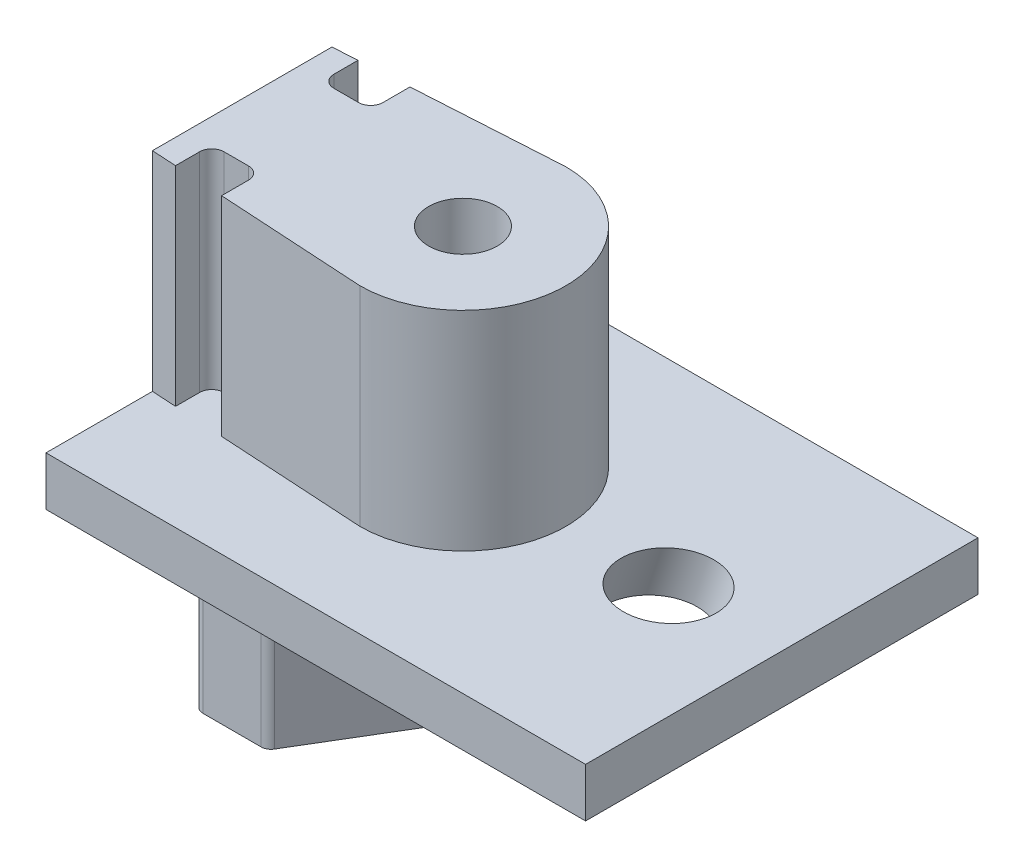
ISO-10303-21;
HEADER;
FILE_DESCRIPTION(('STEP AP214'),'2;1');
FILE_NAME('part.step','',(''),(''),'','','');
FILE_SCHEMA(('AUTOMOTIVE_DESIGN { 1 0 10303 214 1 1 1 1 }'));
ENDSEC;
DATA;
#1=APPLICATION_CONTEXT('core data for automotive mechanical design processes');
#2=APPLICATION_PROTOCOL_DEFINITION('international standard','automotive_design',2000,#1);
#3=PRODUCT_CONTEXT('',#1,'mechanical');
#4=PRODUCT('Part','Part','',(#3));
#5=PRODUCT_RELATED_PRODUCT_CATEGORY('part','',(#4));
#6=PRODUCT_DEFINITION_FORMATION('','',#4);
#7=PRODUCT_DEFINITION_CONTEXT('part definition',#1,'design');
#8=PRODUCT_DEFINITION('design','',#6,#7);
#9=PRODUCT_DEFINITION_SHAPE('','',#8);
#10=(LENGTH_UNIT() NAMED_UNIT(*) SI_UNIT(.MILLI.,.METRE.));
#11=(NAMED_UNIT(*) PLANE_ANGLE_UNIT() SI_UNIT($,.RADIAN.));
#12=(NAMED_UNIT(*) SI_UNIT($,.STERADIAN.) SOLID_ANGLE_UNIT());
#13=UNCERTAINTY_MEASURE_WITH_UNIT(LENGTH_MEASURE(1.E-05),#10,'distance_accuracy_value','');
#14=(GEOMETRIC_REPRESENTATION_CONTEXT(3) GLOBAL_UNCERTAINTY_ASSIGNED_CONTEXT((#13)) GLOBAL_UNIT_ASSIGNED_CONTEXT((#10,
#11,#12)) REPRESENTATION_CONTEXT('',''));
#15=CARTESIAN_POINT('',(0.,0.,0.));
#16=DIRECTION('',(0.,0.,1.));
#17=DIRECTION('',(1.,0.,0.));
#18=AXIS2_PLACEMENT_3D('',#15,#16,#17);
#19=CARTESIAN_POINT('',(-2.50000000000002,2.125,0.9));
#20=DIRECTION('',(0.0598922907279451,0.,-0.998204845465779));
#21=DIRECTION('',(-0.998204845465779,0.,-0.0598922907279451));
#22=AXIS2_PLACEMENT_3D('',#19,#20,#21);
#23=PLANE('',#22);
#24=DIRECTION('',(0.998204845465779,0.,0.0598922907279451));
#25=VECTOR('',#24,1.);
#26=CARTESIAN_POINT('',(-2.50000000000002,2.125,0.9));
#27=LINE('',#26,#25);
#28=CARTESIAN_POINT('',(-2.25,2.125,0.915000000000001));
#29=VERTEX_POINT('',#28);
#30=CARTESIAN_POINT('',(-2.,2.125,0.93));
#31=VERTEX_POINT('',#30);
#32=EDGE_CURVE('E298',#29,#31,#27,.T.);
#33=ORIENTED_EDGE('',*,*,#32,.F.);
#34=DIRECTION('',(0.,-1.,0.));
#35=VECTOR('',#34,1.);
#36=CARTESIAN_POINT('',(-2.25,2.125,0.915000000000001));
#37=LINE('',#36,#35);
#38=CARTESIAN_POINT('',(-2.25,0.,0.915000000000001));
#39=VERTEX_POINT('',#38);
#40=EDGE_CURVE('E246',#29,#39,#37,.T.);
#41=ORIENTED_EDGE('',*,*,#40,.T.);
#42=DIRECTION('',(0.998204845465779,0.,0.0598922907279451));
#43=VECTOR('',#42,1.);
#44=CARTESIAN_POINT('',(-2.50000000000002,0.,0.9));
#45=LINE('',#44,#43);
#46=CARTESIAN_POINT('',(-2.,0.,0.93));
#47=VERTEX_POINT('',#46);
#48=EDGE_CURVE('E273',#39,#47,#45,.T.);
#49=ORIENTED_EDGE('',*,*,#48,.T.);
#50=DIRECTION('',(0.,-1.,0.));
#51=VECTOR('',#50,1.);
#52=CARTESIAN_POINT('',(-2.,2.125,0.93));
#53=LINE('',#52,#51);
#54=EDGE_CURVE('E311',#31,#47,#53,.T.);
#55=ORIENTED_EDGE('',*,*,#54,.F.);
#56=EDGE_LOOP('',(#33,#41,#49,#55));
#57=FACE_BOUND('',#56,.T.);
#58=ADVANCED_FACE('F37',(#57),#23,.F.);
#59=CARTESIAN_POINT('',(-2.,2.125,0.93));
#60=DIRECTION('',(-1.,0.,0.));
#61=DIRECTION('',(0.,0.,1.));
#62=AXIS2_PLACEMENT_3D('',#59,#60,#61);
#63=PLANE('',#62);
#64=DIRECTION('',(0.,0.,-1.));
#65=VECTOR('',#64,1.);
#66=CARTESIAN_POINT('',(-2.,0.,0.93));
#67=LINE('',#66,#65);
#68=CARTESIAN_POINT('',(-2.,0.,0.685));
#69=VERTEX_POINT('',#68);
#70=EDGE_CURVE('E276',#47,#69,#67,.T.);
#71=ORIENTED_EDGE('',*,*,#70,.T.);
#72=DIRECTION('',(0.,-1.,0.));
#73=VECTOR('',#72,1.);
#74=CARTESIAN_POINT('',(-2.,2.125,0.685));
#75=LINE('',#74,#73);
#76=CARTESIAN_POINT('',(-2.,2.125,0.685));
#77=VERTEX_POINT('',#76);
#78=EDGE_CURVE('E319',#69,#77,#75,.F.);
#79=ORIENTED_EDGE('',*,*,#78,.T.);
#80=DIRECTION('',(0.,0.,-1.));
#81=VECTOR('',#80,1.);
#82=CARTESIAN_POINT('',(-2.,2.125,0.93));
#83=LINE('',#82,#81);
#84=EDGE_CURVE('E487',#31,#77,#83,.T.);
#85=ORIENTED_EDGE('',*,*,#84,.F.);
#86=ORIENTED_EDGE('',*,*,#54,.T.);
#87=EDGE_LOOP('',(#71,#79,#85,#86));
#88=FACE_BOUND('',#87,.T.);
#89=ADVANCED_FACE('F559',(#88),#63,.F.);
#90=CARTESIAN_POINT('',(-1.5,2.125,0.56));
#91=DIRECTION('',(0.,0.,1.));
#92=DIRECTION('',(1.,0.,0.));
#93=AXIS2_PLACEMENT_3D('',#90,#91,#92);
#94=PLANE('',#93);
#95=DIRECTION('',(-1.,0.,0.));
#96=VECTOR('',#95,1.);
#97=CARTESIAN_POINT('',(-1.5,2.125,0.56));
#98=LINE('',#97,#96);
#99=CARTESIAN_POINT('',(-1.625,2.125,0.56));
#100=VERTEX_POINT('',#99);
#101=CARTESIAN_POINT('',(-1.875,2.125,0.56));
#102=VERTEX_POINT('',#101);
#103=EDGE_CURVE('E490',#100,#102,#98,.T.);
#104=ORIENTED_EDGE('',*,*,#103,.T.);
#105=DIRECTION('',(0.,-1.,0.));
#106=VECTOR('',#105,1.);
#107=CARTESIAN_POINT('',(-1.875,2.125,0.56));
#108=LINE('',#107,#106);
#109=CARTESIAN_POINT('',(-1.875,0.,0.56));
#110=VERTEX_POINT('',#109);
#111=EDGE_CURVE('E316',#102,#110,#108,.T.);
#112=ORIENTED_EDGE('',*,*,#111,.T.);
#113=DIRECTION('',(-1.,0.,0.));
#114=VECTOR('',#113,1.);
#115=CARTESIAN_POINT('',(-1.5,0.,0.56));
#116=LINE('',#115,#114);
#117=CARTESIAN_POINT('',(-1.625,0.,0.56));
#118=VERTEX_POINT('',#117);
#119=EDGE_CURVE('E280',#118,#110,#116,.T.);
#120=ORIENTED_EDGE('',*,*,#119,.F.);
#121=DIRECTION('',(0.,-1.,0.));
#122=VECTOR('',#121,1.);
#123=CARTESIAN_POINT('',(-1.625,2.125,0.56));
#124=LINE('',#123,#122);
#125=EDGE_CURVE('E314',#118,#100,#124,.F.);
#126=ORIENTED_EDGE('',*,*,#125,.T.);
#127=EDGE_LOOP('',(#104,#112,#120,#126));
#128=FACE_BOUND('',#127,.T.);
#129=ADVANCED_FACE('F549',(#128),#94,.T.);
#130=CARTESIAN_POINT('',(-1.5,2.125,0.56));
#131=DIRECTION('',(1.,0.,0.));
#132=DIRECTION('',(0.,0.,-1.));
#133=AXIS2_PLACEMENT_3D('',#130,#131,#132);
#134=PLANE('',#133);
#135=DIRECTION('',(0.,0.,1.));
#136=VECTOR('',#135,1.);
#137=CARTESIAN_POINT('',(-1.5,2.125,0.56));
#138=LINE('',#137,#136);
#139=CARTESIAN_POINT('',(-1.5,2.125,0.685));
#140=VERTEX_POINT('',#139);
#141=CARTESIAN_POINT('',(-1.5,2.125,0.96));
#142=VERTEX_POINT('',#141);
#143=EDGE_CURVE('E493',#140,#142,#138,.T.);
#144=ORIENTED_EDGE('',*,*,#143,.F.);
#145=DIRECTION('',(0.,-1.,0.));
#146=VECTOR('',#145,1.);
#147=CARTESIAN_POINT('',(-1.5,2.125,0.685));
#148=LINE('',#147,#146);
#149=CARTESIAN_POINT('',(-1.5,0.,0.685));
#150=VERTEX_POINT('',#149);
#151=EDGE_CURVE('E321',#140,#150,#148,.T.);
#152=ORIENTED_EDGE('',*,*,#151,.T.);
#153=DIRECTION('',(0.,0.,1.));
#154=VECTOR('',#153,1.);
#155=CARTESIAN_POINT('',(-1.5,0.,0.56));
#156=LINE('',#155,#154);
#157=CARTESIAN_POINT('',(-1.5,0.,0.96));
#158=VERTEX_POINT('',#157);
#159=EDGE_CURVE('E282',#150,#158,#156,.T.);
#160=ORIENTED_EDGE('',*,*,#159,.T.);
#161=DIRECTION('',(0.,-1.,0.));
#162=VECTOR('',#161,1.);
#163=CARTESIAN_POINT('',(-1.5,2.125,0.96));
#164=LINE('',#163,#162);
#165=EDGE_CURVE('E308',#142,#158,#164,.T.);
#166=ORIENTED_EDGE('',*,*,#165,.F.);
#167=EDGE_LOOP('',(#144,#152,#160,#166));
#168=FACE_BOUND('',#167,.T.);
#169=ADVANCED_FACE('F539',(#168),#134,.F.);
#170=CARTESIAN_POINT('',(0.,2.125,1.05));
#171=DIRECTION('',(-0.0598922907279466,0.,0.998204845465779));
#172=DIRECTION('',(0.998204845465779,0.,0.0598922907279466));
#173=AXIS2_PLACEMENT_3D('',#170,#171,#172);
#174=PLANE('',#173);
#175=DIRECTION('',(-0.998204845465779,0.,-0.0598922907279466));
#176=VECTOR('',#175,1.);
#177=CARTESIAN_POINT('',(0.,0.,1.05));
#178=LINE('',#177,#176);
#179=CARTESIAN_POINT('',(0.,0.,1.05));
#180=VERTEX_POINT('',#179);
#181=EDGE_CURVE('E285',#180,#158,#178,.T.);
#182=ORIENTED_EDGE('',*,*,#181,.F.);
#183=DIRECTION('',(0.,-1.,0.));
#184=VECTOR('',#183,1.);
#185=CARTESIAN_POINT('',(0.,2.125,1.05));
#186=LINE('',#185,#184);
#187=CARTESIAN_POINT('',(0.,2.125,1.05));
#188=VERTEX_POINT('',#187);
#189=EDGE_CURVE('E305',#188,#180,#186,.T.);
#190=ORIENTED_EDGE('',*,*,#189,.F.);
#191=DIRECTION('',(-0.998204845465779,0.,-0.0598922907279466));
#192=VECTOR('',#191,1.);
#193=CARTESIAN_POINT('',(0.,2.125,1.05));
#194=LINE('',#193,#192);
#195=EDGE_CURVE('E495',#188,#142,#194,.T.);
#196=ORIENTED_EDGE('',*,*,#195,.T.);
#197=ORIENTED_EDGE('',*,*,#165,.T.);
#198=EDGE_LOOP('',(#182,#190,#196,#197));
#199=FACE_BOUND('',#198,.T.);
#200=ADVANCED_FACE('F535',(#199),#174,.T.);
#201=CARTESIAN_POINT('',(0.,2.125,0.));
#202=DIRECTION('',(0.,-1.,0.));
#203=DIRECTION('',(0.,0.,-1.));
#204=AXIS2_PLACEMENT_3D('',#201,#202,#203);
#205=CYLINDRICAL_SURFACE('',#204,1.05);
#206=CARTESIAN_POINT('',(0.,0.,0.));
#207=DIRECTION('',(0.,-1.,0.));
#208=DIRECTION('',(0.,0.,-1.));
#209=AXIS2_PLACEMENT_3D('',#206,#207,#208);
#210=CIRCLE('',#209,1.05);
#211=CARTESIAN_POINT('',(0.,0.,-1.05));
#212=VERTEX_POINT('',#211);
#213=EDGE_CURVE('E287',#212,#180,#210,.T.);
#214=ORIENTED_EDGE('',*,*,#213,.F.);
#215=DIRECTION('',(0.,-1.,0.));
#216=VECTOR('',#215,1.);
#217=CARTESIAN_POINT('',(0.,2.125,-1.05));
#218=LINE('',#217,#216);
#219=CARTESIAN_POINT('',(0.,2.125,-1.05));
#220=VERTEX_POINT('',#219);
#221=EDGE_CURVE('E302',#220,#212,#218,.T.);
#222=ORIENTED_EDGE('',*,*,#221,.F.);
#223=CARTESIAN_POINT('',(0.,2.125,0.));
#224=DIRECTION('',(0.,-1.,0.));
#225=DIRECTION('',(0.,0.,-1.));
#226=AXIS2_PLACEMENT_3D('',#223,#224,#225);
#227=CIRCLE('',#226,1.05);
#228=EDGE_CURVE('E498',#220,#188,#227,.T.);
#229=ORIENTED_EDGE('',*,*,#228,.T.);
#230=ORIENTED_EDGE('',*,*,#189,.T.);
#231=EDGE_LOOP('',(#214,#222,#229,#230));
#232=FACE_BOUND('',#231,.T.);
#233=ADVANCED_FACE('F531',(#232),#205,.T.);
#234=CARTESIAN_POINT('',(-1.5,2.125,-0.96));
#235=DIRECTION('',(-0.0598922907279466,0.,-0.998204845465779));
#236=DIRECTION('',(-0.998204845465779,0.,0.0598922907279466));
#237=AXIS2_PLACEMENT_3D('',#234,#235,#236);
#238=PLANE('',#237);
#239=DIRECTION('',(0.998204845465779,0.,-0.0598922907279466));
#240=VECTOR('',#239,1.);
#241=CARTESIAN_POINT('',(-1.5,0.,-0.96));
#242=LINE('',#241,#240);
#243=CARTESIAN_POINT('',(-1.5,0.,-0.96));
#244=VERTEX_POINT('',#243);
#245=EDGE_CURVE('E289',#244,#212,#242,.T.);
#246=ORIENTED_EDGE('',*,*,#245,.F.);
#247=DIRECTION('',(0.,-1.,0.));
#248=VECTOR('',#247,1.);
#249=CARTESIAN_POINT('',(-1.5,2.125,-0.96));
#250=LINE('',#249,#248);
#251=CARTESIAN_POINT('',(-1.5,2.125,-0.96));
#252=VERTEX_POINT('',#251);
#253=EDGE_CURVE('E267',#252,#244,#250,.T.);
#254=ORIENTED_EDGE('',*,*,#253,.F.);
#255=DIRECTION('',(0.998204845465779,0.,-0.0598922907279466));
#256=VECTOR('',#255,1.);
#257=CARTESIAN_POINT('',(-1.5,2.125,-0.96));
#258=LINE('',#257,#256);
#259=EDGE_CURVE('E501',#252,#220,#258,.T.);
#260=ORIENTED_EDGE('',*,*,#259,.T.);
#261=ORIENTED_EDGE('',*,*,#221,.T.);
#262=EDGE_LOOP('',(#246,#254,#260,#261));
#263=FACE_BOUND('',#262,.T.);
#264=ADVANCED_FACE('F527',(#263),#238,.T.);
#265=CARTESIAN_POINT('',(-1.5,2.125,-0.96));
#266=DIRECTION('',(1.,0.,0.));
#267=DIRECTION('',(0.,0.,-1.));
#268=AXIS2_PLACEMENT_3D('',#265,#266,#267);
#269=PLANE('',#268);
#270=DIRECTION('',(0.,0.,1.));
#271=VECTOR('',#270,1.);
#272=CARTESIAN_POINT('',(-1.5,0.,-0.96));
#273=LINE('',#272,#271);
#274=CARTESIAN_POINT('',(-1.5,0.,-0.685));
#275=VERTEX_POINT('',#274);
#276=EDGE_CURVE('E291',#244,#275,#273,.T.);
#277=ORIENTED_EDGE('',*,*,#276,.T.);
#278=DIRECTION('',(0.,-1.,0.));
#279=VECTOR('',#278,1.);
#280=CARTESIAN_POINT('',(-1.5,2.125,-0.685));
#281=LINE('',#280,#279);
#282=CARTESIAN_POINT('',(-1.5,2.125,-0.685));
#283=VERTEX_POINT('',#282);
#284=EDGE_CURVE('E329',#275,#283,#281,.F.);
#285=ORIENTED_EDGE('',*,*,#284,.T.);
#286=DIRECTION('',(0.,0.,1.));
#287=VECTOR('',#286,1.);
#288=CARTESIAN_POINT('',(-1.5,2.125,-0.96));
#289=LINE('',#288,#287);
#290=EDGE_CURVE('E504',#252,#283,#289,.T.);
#291=ORIENTED_EDGE('',*,*,#290,.F.);
#292=ORIENTED_EDGE('',*,*,#253,.T.);
#293=EDGE_LOOP('',(#277,#285,#291,#292));
#294=FACE_BOUND('',#293,.T.);
#295=ADVANCED_FACE('F522',(#294),#269,.F.);
#296=CARTESIAN_POINT('',(-2.,2.125,-0.56));
#297=DIRECTION('',(0.,0.,-1.));
#298=DIRECTION('',(-1.,0.,0.));
#299=AXIS2_PLACEMENT_3D('',#296,#297,#298);
#300=PLANE('',#299);
#301=DIRECTION('',(1.,0.,0.));
#302=VECTOR('',#301,1.);
#303=CARTESIAN_POINT('',(-2.,2.125,-0.56));
#304=LINE('',#303,#302);
#305=CARTESIAN_POINT('',(-1.875,2.125,-0.56));
#306=VERTEX_POINT('',#305);
#307=CARTESIAN_POINT('',(-1.625,2.125,-0.56));
#308=VERTEX_POINT('',#307);
#309=EDGE_CURVE('E269',#306,#308,#304,.T.);
#310=ORIENTED_EDGE('',*,*,#309,.T.);
#311=DIRECTION('',(0.,-1.,0.));
#312=VECTOR('',#311,1.);
#313=CARTESIAN_POINT('',(-1.625,2.125,-0.56));
#314=LINE('',#313,#312);
#315=CARTESIAN_POINT('',(-1.625,0.,-0.56));
#316=VERTEX_POINT('',#315);
#317=EDGE_CURVE('E326',#308,#316,#314,.T.);
#318=ORIENTED_EDGE('',*,*,#317,.T.);
#319=DIRECTION('',(1.,0.,0.));
#320=VECTOR('',#319,1.);
#321=CARTESIAN_POINT('',(-2.,0.,-0.56));
#322=LINE('',#321,#320);
#323=CARTESIAN_POINT('',(-1.875,0.,-0.56));
#324=VERTEX_POINT('',#323);
#325=EDGE_CURVE('E294',#324,#316,#322,.T.);
#326=ORIENTED_EDGE('',*,*,#325,.F.);
#327=DIRECTION('',(0.,-1.,0.));
#328=VECTOR('',#327,1.);
#329=CARTESIAN_POINT('',(-1.875,2.125,-0.56));
#330=LINE('',#329,#328);
#331=EDGE_CURVE('E324',#324,#306,#330,.F.);
#332=ORIENTED_EDGE('',*,*,#331,.T.);
#333=EDGE_LOOP('',(#310,#318,#326,#332));
#334=FACE_BOUND('',#333,.T.);
#335=ADVANCED_FACE('F510',(#334),#300,.T.);
#336=CARTESIAN_POINT('',(-2.,2.125,-0.93));
#337=DIRECTION('',(1.,0.,0.));
#338=DIRECTION('',(0.,0.,-1.));
#339=AXIS2_PLACEMENT_3D('',#336,#337,#338);
#340=PLANE('',#339);
#341=DIRECTION('',(0.,0.,1.));
#342=VECTOR('',#341,1.);
#343=CARTESIAN_POINT('',(-2.,2.125,-0.93));
#344=LINE('',#343,#342);
#345=CARTESIAN_POINT('',(-2.,2.125,-0.93));
#346=VERTEX_POINT('',#345);
#347=CARTESIAN_POINT('',(-2.,2.125,-0.685));
#348=VERTEX_POINT('',#347);
#349=EDGE_CURVE('E264',#346,#348,#344,.T.);
#350=ORIENTED_EDGE('',*,*,#349,.T.);
#351=DIRECTION('',(0.,-1.,0.));
#352=VECTOR('',#351,1.);
#353=CARTESIAN_POINT('',(-2.,0.,-0.685));
#354=LINE('',#353,#352);
#355=CARTESIAN_POINT('',(-2.,0.,-0.685));
#356=VERTEX_POINT('',#355);
#357=EDGE_CURVE('E331',#348,#356,#354,.T.);
#358=ORIENTED_EDGE('',*,*,#357,.T.);
#359=DIRECTION('',(0.,0.,1.));
#360=VECTOR('',#359,1.);
#361=CARTESIAN_POINT('',(-2.,0.,-0.93));
#362=LINE('',#361,#360);
#363=CARTESIAN_POINT('',(-2.,0.,-0.93));
#364=VERTEX_POINT('',#363);
#365=EDGE_CURVE('E296',#364,#356,#362,.T.);
#366=ORIENTED_EDGE('',*,*,#365,.F.);
#367=DIRECTION('',(0.,-1.,0.));
#368=VECTOR('',#367,1.);
#369=CARTESIAN_POINT('',(-2.,2.125,-0.93));
#370=LINE('',#369,#368);
#371=EDGE_CURVE('E265',#346,#364,#370,.T.);
#372=ORIENTED_EDGE('',*,*,#371,.F.);
#373=EDGE_LOOP('',(#350,#358,#366,#372));
#374=FACE_BOUND('',#373,.T.);
#375=ADVANCED_FACE('F673',(#374),#340,.T.);
#376=CARTESIAN_POINT('',(-2.50000000000002,2.125,-0.9));
#377=DIRECTION('',(-0.0598922907279451,0.,-0.998204845465779));
#378=DIRECTION('',(-0.998204845465779,0.,0.0598922907279451));
#379=AXIS2_PLACEMENT_3D('',#376,#377,#378);
#380=PLANE('',#379);
#381=DIRECTION('',(0.,-1.,0.));
#382=VECTOR('',#381,1.);
#383=CARTESIAN_POINT('',(-2.25,2.125,-0.915000000000001));
#384=LINE('',#383,#382);
#385=CARTESIAN_POINT('',(-2.25,2.125,-0.915));
#386=VERTEX_POINT('',#385);
#387=CARTESIAN_POINT('',(-2.25,0.,-0.915));
#388=VERTEX_POINT('',#387);
#389=EDGE_CURVE('E243',#386,#388,#384,.T.);
#390=ORIENTED_EDGE('',*,*,#389,.F.);
#391=DIRECTION('',(0.998204845465779,0.,-0.0598922907279451));
#392=VECTOR('',#391,1.);
#393=CARTESIAN_POINT('',(-2.50000000000002,2.125,-0.9));
#394=LINE('',#393,#392);
#395=EDGE_CURVE('E256',#386,#346,#394,.T.);
#396=ORIENTED_EDGE('',*,*,#395,.T.);
#397=ORIENTED_EDGE('',*,*,#371,.T.);
#398=DIRECTION('',(0.998204845465779,0.,-0.0598922907279451));
#399=VECTOR('',#398,1.);
#400=CARTESIAN_POINT('',(-2.50000000000002,0.,-0.9));
#401=LINE('',#400,#399);
#402=EDGE_CURVE('E258',#388,#364,#401,.T.);
#403=ORIENTED_EDGE('',*,*,#402,.F.);
#404=EDGE_LOOP('',(#390,#396,#397,#403));
#405=FACE_BOUND('',#404,.T.);
#406=ADVANCED_FACE('F254',(#405),#380,.T.);
#407=CARTESIAN_POINT('',(0.,2.125,0.));
#408=DIRECTION('',(0.,-1.,0.));
#409=DIRECTION('',(0.,0.,-1.));
#410=AXIS2_PLACEMENT_3D('',#407,#408,#409);
#411=PLANE('',#410);
#412=CARTESIAN_POINT('',(0.,2.125,0.));
#413=DIRECTION('',(0.,1.,0.));
#414=DIRECTION('',(0.,0.,1.));
#415=AXIS2_PLACEMENT_3D('',#412,#413,#414);
#416=CIRCLE('',#415,0.35);
#417=CARTESIAN_POINT('',(0.,2.125,0.35));
#418=VERTEX_POINT('',#417);
#419=EDGE_CURVE('E475',#418,#418,#416,.T.);
#420=ORIENTED_EDGE('',*,*,#419,.F.);
#421=EDGE_LOOP('',(#420));
#422=FACE_BOUND('',#421,.T.);
#423=ORIENTED_EDGE('',*,*,#395,.F.);
#424=DIRECTION('',(0.,0.,1.));
#425=VECTOR('',#424,1.);
#426=CARTESIAN_POINT('',(-2.25,2.125,2.));
#427=LINE('',#426,#425);
#428=EDGE_CURVE('E239',#386,#29,#427,.T.);
#429=ORIENTED_EDGE('',*,*,#428,.T.);
#430=ORIENTED_EDGE('',*,*,#32,.T.);
#431=ORIENTED_EDGE('',*,*,#84,.T.);
#432=CARTESIAN_POINT('',(-1.875,2.125,0.685));
#433=DIRECTION('',(0.,-1.,0.));
#434=DIRECTION('',(0.,0.,-1.));
#435=AXIS2_PLACEMENT_3D('',#432,#433,#434);
#436=CIRCLE('',#435,0.125);
#437=EDGE_CURVE('E336',#77,#102,#436,.T.);
#438=ORIENTED_EDGE('',*,*,#437,.T.);
#439=ORIENTED_EDGE('',*,*,#103,.F.);
#440=CARTESIAN_POINT('',(-1.625,2.125,0.685));
#441=DIRECTION('',(0.,-1.,0.));
#442=DIRECTION('',(0.,0.,-1.));
#443=AXIS2_PLACEMENT_3D('',#440,#441,#442);
#444=CIRCLE('',#443,0.125);
#445=EDGE_CURVE('E340',#100,#140,#444,.T.);
#446=ORIENTED_EDGE('',*,*,#445,.T.);
#447=ORIENTED_EDGE('',*,*,#143,.T.);
#448=ORIENTED_EDGE('',*,*,#195,.F.);
#449=ORIENTED_EDGE('',*,*,#228,.F.);
#450=ORIENTED_EDGE('',*,*,#259,.F.);
#451=ORIENTED_EDGE('',*,*,#290,.T.);
#452=CARTESIAN_POINT('',(-1.625,2.125,-0.685));
#453=DIRECTION('',(0.,-1.,0.));
#454=DIRECTION('',(0.,0.,-1.));
#455=AXIS2_PLACEMENT_3D('',#452,#453,#454);
#456=CIRCLE('',#455,0.125);
#457=EDGE_CURVE('E344',#283,#308,#456,.T.);
#458=ORIENTED_EDGE('',*,*,#457,.T.);
#459=ORIENTED_EDGE('',*,*,#309,.F.);
#460=CARTESIAN_POINT('',(-1.875,2.125,-0.685));
#461=DIRECTION('',(0.,-1.,0.));
#462=DIRECTION('',(0.,0.,-1.));
#463=AXIS2_PLACEMENT_3D('',#460,#461,#462);
#464=CIRCLE('',#463,0.125);
#465=EDGE_CURVE('E348',#306,#348,#464,.T.);
#466=ORIENTED_EDGE('',*,*,#465,.T.);
#467=ORIENTED_EDGE('',*,*,#349,.F.);
#468=EDGE_LOOP('',(#423,#429,#430,#431,#438,#439,#446,#447,#448,#449,#450,#451,#458,#459,#466,#467));
#469=FACE_BOUND('',#468,.T.);
#470=ADVANCED_FACE('F262',(#422,#469),#411,.F.);
#471=CARTESIAN_POINT('',(0.,0.,0.));
#472=DIRECTION('',(0.,1.,0.));
#473=DIRECTION('',(0.,0.,1.));
#474=AXIS2_PLACEMENT_3D('',#471,#472,#473);
#475=CYLINDRICAL_SURFACE('',#474,0.35);
#476=CARTESIAN_POINT('',(0.,0.,0.));
#477=DIRECTION('',(0.,1.,0.));
#478=DIRECTION('',(0.,0.,1.));
#479=AXIS2_PLACEMENT_3D('',#476,#477,#478);
#480=CIRCLE('',#479,0.35);
#481=CARTESIAN_POINT('',(0.,0.,0.35));
#482=VERTEX_POINT('',#481);
#483=EDGE_CURVE('E277',#482,#482,#480,.T.);
#484=ORIENTED_EDGE('',*,*,#483,.F.);
#485=EDGE_LOOP('',(#484));
#486=FACE_BOUND('',#485,.T.);
#487=ORIENTED_EDGE('',*,*,#419,.T.);
#488=EDGE_LOOP('',(#487));
#489=FACE_BOUND('',#488,.T.);
#490=ADVANCED_FACE('F598',(#486,#489),#475,.F.);
#491=CARTESIAN_POINT('',(-1.875,2.125,0.685));
#492=DIRECTION('',(0.,-1.,0.));
#493=DIRECTION('',(0.,0.,-1.));
#494=AXIS2_PLACEMENT_3D('',#491,#492,#493);
#495=CYLINDRICAL_SURFACE('',#494,0.125);
#496=ORIENTED_EDGE('',*,*,#437,.F.);
#497=ORIENTED_EDGE('',*,*,#78,.F.);
#498=CARTESIAN_POINT('',(-1.875,0.,0.685));
#499=DIRECTION('',(0.,-1.,0.));
#500=DIRECTION('',(0.,0.,-1.));
#501=AXIS2_PLACEMENT_3D('',#498,#499,#500);
#502=CIRCLE('',#501,0.125);
#503=EDGE_CURVE('E334',#110,#69,#502,.F.);
#504=ORIENTED_EDGE('',*,*,#503,.F.);
#505=ORIENTED_EDGE('',*,*,#111,.F.);
#506=EDGE_LOOP('',(#496,#497,#504,#505));
#507=FACE_BOUND('',#506,.T.);
#508=ADVANCED_FACE('F555',(#507),#495,.F.);
#509=CARTESIAN_POINT('',(-1.625,2.125,0.685));
#510=DIRECTION('',(0.,-1.,0.));
#511=DIRECTION('',(0.,0.,-1.));
#512=AXIS2_PLACEMENT_3D('',#509,#510,#511);
#513=CYLINDRICAL_SURFACE('',#512,0.125);
#514=ORIENTED_EDGE('',*,*,#445,.F.);
#515=ORIENTED_EDGE('',*,*,#125,.F.);
#516=CARTESIAN_POINT('',(-1.625,0.,0.685));
#517=DIRECTION('',(0.,-1.,0.));
#518=DIRECTION('',(0.,0.,-1.));
#519=AXIS2_PLACEMENT_3D('',#516,#517,#518);
#520=CIRCLE('',#519,0.125);
#521=EDGE_CURVE('E338',#150,#118,#520,.F.);
#522=ORIENTED_EDGE('',*,*,#521,.F.);
#523=ORIENTED_EDGE('',*,*,#151,.F.);
#524=EDGE_LOOP('',(#514,#515,#522,#523));
#525=FACE_BOUND('',#524,.T.);
#526=ADVANCED_FACE('F546',(#525),#513,.F.);
#527=CARTESIAN_POINT('',(-1.625,2.125,-0.685));
#528=DIRECTION('',(0.,-1.,0.));
#529=DIRECTION('',(0.,0.,-1.));
#530=AXIS2_PLACEMENT_3D('',#527,#528,#529);
#531=CYLINDRICAL_SURFACE('',#530,0.125);
#532=ORIENTED_EDGE('',*,*,#457,.F.);
#533=ORIENTED_EDGE('',*,*,#284,.F.);
#534=CARTESIAN_POINT('',(-1.625,0.,-0.685));
#535=DIRECTION('',(0.,-1.,0.));
#536=DIRECTION('',(0.,0.,-1.));
#537=AXIS2_PLACEMENT_3D('',#534,#535,#536);
#538=CIRCLE('',#537,0.125);
#539=EDGE_CURVE('E342',#316,#275,#538,.F.);
#540=ORIENTED_EDGE('',*,*,#539,.F.);
#541=ORIENTED_EDGE('',*,*,#317,.F.);
#542=EDGE_LOOP('',(#532,#533,#540,#541));
#543=FACE_BOUND('',#542,.T.);
#544=ADVANCED_FACE('F517',(#543),#531,.F.);
#545=CARTESIAN_POINT('',(-1.875,2.125,-0.685));
#546=DIRECTION('',(0.,1.,0.));
#547=DIRECTION('',(0.,0.,1.));
#548=AXIS2_PLACEMENT_3D('',#545,#546,#547);
#549=CYLINDRICAL_SURFACE('',#548,0.125);
#550=ORIENTED_EDGE('',*,*,#465,.F.);
#551=ORIENTED_EDGE('',*,*,#331,.F.);
#552=CARTESIAN_POINT('',(-1.875,0.,-0.685));
#553=DIRECTION('',(0.,-1.,0.));
#554=DIRECTION('',(0.,0.,-1.));
#555=AXIS2_PLACEMENT_3D('',#552,#553,#554);
#556=CIRCLE('',#555,0.125);
#557=EDGE_CURVE('E346',#356,#324,#556,.F.);
#558=ORIENTED_EDGE('',*,*,#557,.F.);
#559=ORIENTED_EDGE('',*,*,#357,.F.);
#560=EDGE_LOOP('',(#550,#551,#558,#559));
#561=FACE_BOUND('',#560,.T.);
#562=ADVANCED_FACE('F603',(#561),#549,.F.);
#563=CARTESIAN_POINT('',(0.,0.,0.));
#564=DIRECTION('',(0.,-1.,0.));
#565=DIRECTION('',(0.,0.,-1.));
#566=AXIS2_PLACEMENT_3D('',#563,#564,#565);
#567=PLANE('',#566);
#568=CARTESIAN_POINT('',(0.,0.,0.));
#569=DIRECTION('',(0.,1.,0.));
#570=DIRECTION('',(0.,0.,1.));
#571=AXIS2_PLACEMENT_3D('',#568,#569,#570);
#572=CIRCLE('',#571,0.125);
#573=CARTESIAN_POINT('',(0.,0.,0.125));
#574=VERTEX_POINT('',#573);
#575=EDGE_CURVE('E442',#574,#574,#572,.T.);
#576=ORIENTED_EDGE('',*,*,#575,.F.);
#577=EDGE_LOOP('',(#576));
#578=FACE_BOUND('',#577,.T.);
#579=ORIENTED_EDGE('',*,*,#483,.T.);
#580=EDGE_LOOP('',(#579));
#581=FACE_BOUND('',#580,.T.);
#582=ADVANCED_FACE('F606',(#578,#581),#567,.F.);
#583=CARTESIAN_POINT('',(2.09546854596071,0.,0.));
#584=DIRECTION('',(0.,-1.,0.));
#585=DIRECTION('',(1.,0.,0.));
#586=AXIS2_PLACEMENT_3D('',#583,#584,#585);
#587=ELLIPSE('',#586,0.484882574559151,0.46);
#588=CARTESIAN_POINT('',(2.58035112051986,0.,0.));
#589=VERTEX_POINT('',#588);
#590=EDGE_CURVE('E353',#589,#589,#587,.T.);
#591=ORIENTED_EDGE('',*,*,#590,.T.);
#592=EDGE_LOOP('',(#591));
#593=FACE_BOUND('',#592,.T.);
#594=DIRECTION('',(0.,0.,1.));
#595=VECTOR('',#594,1.);
#596=CARTESIAN_POINT('',(-2.25,0.,2.));
#597=LINE('',#596,#595);
#598=CARTESIAN_POINT('',(-2.25,0.,-2.));
#599=VERTEX_POINT('',#598);
#600=EDGE_CURVE('E465',#599,#388,#597,.T.);
#601=ORIENTED_EDGE('',*,*,#600,.T.);
#602=ORIENTED_EDGE('',*,*,#402,.T.);
#603=ORIENTED_EDGE('',*,*,#365,.T.);
#604=ORIENTED_EDGE('',*,*,#557,.T.);
#605=ORIENTED_EDGE('',*,*,#325,.T.);
#606=ORIENTED_EDGE('',*,*,#539,.T.);
#607=ORIENTED_EDGE('',*,*,#276,.F.);
#608=ORIENTED_EDGE('',*,*,#245,.T.);
#609=ORIENTED_EDGE('',*,*,#213,.T.);
#610=ORIENTED_EDGE('',*,*,#181,.T.);
#611=ORIENTED_EDGE('',*,*,#159,.F.);
#612=ORIENTED_EDGE('',*,*,#521,.T.);
#613=ORIENTED_EDGE('',*,*,#119,.T.);
#614=ORIENTED_EDGE('',*,*,#503,.T.);
#615=ORIENTED_EDGE('',*,*,#70,.F.);
#616=ORIENTED_EDGE('',*,*,#48,.F.);
#617=CARTESIAN_POINT('',(-2.25,0.,2.));
#618=VERTEX_POINT('',#617);
#619=EDGE_CURVE('E464',#39,#618,#597,.T.);
#620=ORIENTED_EDGE('',*,*,#619,.T.);
#621=DIRECTION('',(1.,0.,0.));
#622=VECTOR('',#621,1.);
#623=CARTESIAN_POINT('',(3.25,0.,2.));
#624=LINE('',#623,#622);
#625=CARTESIAN_POINT('',(3.25,0.,2.));
#626=VERTEX_POINT('',#625);
#627=EDGE_CURVE('E467',#618,#626,#624,.T.);
#628=ORIENTED_EDGE('',*,*,#627,.T.);
#629=DIRECTION('',(0.,0.,-1.));
#630=VECTOR('',#629,1.);
#631=CARTESIAN_POINT('',(3.25,0.,-2.));
#632=LINE('',#631,#630);
#633=CARTESIAN_POINT('',(3.25,0.,-2.));
#634=VERTEX_POINT('',#633);
#635=EDGE_CURVE('E453',#626,#634,#632,.T.);
#636=ORIENTED_EDGE('',*,*,#635,.T.);
#637=DIRECTION('',(-1.,0.,0.));
#638=VECTOR('',#637,1.);
#639=CARTESIAN_POINT('',(-2.25,0.,-2.));
#640=LINE('',#639,#638);
#641=EDGE_CURVE('E446',#634,#599,#640,.T.);
#642=ORIENTED_EDGE('',*,*,#641,.T.);
#643=EDGE_LOOP('',(#601,#602,#603,#604,#605,#606,#607,#608,#609,#610,#611,#612,#613,#614,#615,
#616,#620,#628,#636,#642));
#644=FACE_BOUND('',#643,.T.);
#645=ADVANCED_FACE('F520',(#593,#644),#567,.F.);
#646=CARTESIAN_POINT('',(3.25,-0.5,-2.));
#647=DIRECTION('',(1.,0.,0.));
#648=DIRECTION('',(0.,0.,-1.));
#649=AXIS2_PLACEMENT_3D('',#646,#647,#648);
#650=PLANE('',#649);
#651=ORIENTED_EDGE('',*,*,#635,.F.);
#652=DIRECTION('',(0.,1.,0.));
#653=VECTOR('',#652,1.);
#654=CARTESIAN_POINT('',(3.25,-0.5,2.));
#655=LINE('',#654,#653);
#656=CARTESIAN_POINT('',(3.25,-0.5,2.));
#657=VERTEX_POINT('',#656);
#658=EDGE_CURVE('E476',#657,#626,#655,.T.);
#659=ORIENTED_EDGE('',*,*,#658,.F.);
#660=DIRECTION('',(0.,0.,-1.));
#661=VECTOR('',#660,1.);
#662=CARTESIAN_POINT('',(3.25,-0.5,-2.));
#663=LINE('',#662,#661);
#664=CARTESIAN_POINT('',(3.25,-0.5,-2.));
#665=VERTEX_POINT('',#664);
#666=EDGE_CURVE('E458',#657,#665,#663,.T.);
#667=ORIENTED_EDGE('',*,*,#666,.T.);
#668=DIRECTION('',(0.,1.,0.));
#669=VECTOR('',#668,1.);
#670=CARTESIAN_POINT('',(3.25,-0.5,-2.));
#671=LINE('',#670,#669);
#672=EDGE_CURVE('E472',#665,#634,#671,.T.);
#673=ORIENTED_EDGE('',*,*,#672,.T.);
#674=EDGE_LOOP('',(#651,#659,#667,#673));
#675=FACE_BOUND('',#674,.T.);
#676=ADVANCED_FACE('F574',(#675),#650,.T.);
#677=CARTESIAN_POINT('',(3.25,-0.5,2.));
#678=DIRECTION('',(0.,0.,1.));
#679=DIRECTION('',(1.,0.,0.));
#680=AXIS2_PLACEMENT_3D('',#677,#678,#679);
#681=PLANE('',#680);
#682=ORIENTED_EDGE('',*,*,#627,.F.);
#683=DIRECTION('',(0.,1.,0.));
#684=VECTOR('',#683,1.);
#685=CARTESIAN_POINT('',(-2.25,-0.5,2.));
#686=LINE('',#685,#684);
#687=CARTESIAN_POINT('',(-2.25,-0.5,2.));
#688=VERTEX_POINT('',#687);
#689=EDGE_CURVE('E478',#688,#618,#686,.T.);
#690=ORIENTED_EDGE('',*,*,#689,.F.);
#691=DIRECTION('',(1.,0.,0.));
#692=VECTOR('',#691,1.);
#693=CARTESIAN_POINT('',(-2.25,-0.5,2.));
#694=LINE('',#693,#692);
#695=EDGE_CURVE('E456',#688,#657,#694,.T.);
#696=ORIENTED_EDGE('',*,*,#695,.T.);
#697=ORIENTED_EDGE('',*,*,#658,.T.);
#698=EDGE_LOOP('',(#682,#690,#696,#697));
#699=FACE_BOUND('',#698,.T.);
#700=ADVANCED_FACE('F565',(#699),#681,.T.);
#701=CARTESIAN_POINT('',(-2.25,-0.5,2.));
#702=DIRECTION('',(-1.,0.,0.));
#703=DIRECTION('',(0.,0.,1.));
#704=AXIS2_PLACEMENT_3D('',#701,#702,#703);
#705=PLANE('',#704);
#706=ORIENTED_EDGE('',*,*,#600,.F.);
#707=DIRECTION('',(0.,1.,0.));
#708=VECTOR('',#707,1.);
#709=CARTESIAN_POINT('',(-2.25,-0.5,-2.));
#710=LINE('',#709,#708);
#711=CARTESIAN_POINT('',(-2.25,-0.5,-2.));
#712=VERTEX_POINT('',#711);
#713=EDGE_CURVE('E461',#712,#599,#710,.T.);
#714=ORIENTED_EDGE('',*,*,#713,.F.);
#715=DIRECTION('',(0.,0.,1.));
#716=VECTOR('',#715,1.);
#717=CARTESIAN_POINT('',(-2.25,-0.5,2.));
#718=LINE('',#717,#716);
#719=EDGE_CURVE('E452',#712,#688,#718,.T.);
#720=ORIENTED_EDGE('',*,*,#719,.T.);
#721=ORIENTED_EDGE('',*,*,#689,.T.);
#722=ORIENTED_EDGE('',*,*,#619,.F.);
#723=ORIENTED_EDGE('',*,*,#40,.F.);
#724=ORIENTED_EDGE('',*,*,#428,.F.);
#725=ORIENTED_EDGE('',*,*,#389,.T.);
#726=EDGE_LOOP('',(#706,#714,#720,#721,#722,#723,#724,#725));
#727=FACE_BOUND('',#726,.T.);
#728=ADVANCED_FACE('F242',(#727),#705,.T.);
#729=CARTESIAN_POINT('',(-2.25,-0.5,-2.));
#730=DIRECTION('',(0.,0.,-1.));
#731=DIRECTION('',(-1.,0.,0.));
#732=AXIS2_PLACEMENT_3D('',#729,#730,#731);
#733=PLANE('',#732);
#734=ORIENTED_EDGE('',*,*,#641,.F.);
#735=ORIENTED_EDGE('',*,*,#672,.F.);
#736=DIRECTION('',(-1.,0.,0.));
#737=VECTOR('',#736,1.);
#738=CARTESIAN_POINT('',(1.75,-0.5,-2.));
#739=LINE('',#738,#737);
#740=EDGE_CURVE('E450',#665,#712,#739,.T.);
#741=ORIENTED_EDGE('',*,*,#740,.T.);
#742=ORIENTED_EDGE('',*,*,#713,.T.);
#743=EDGE_LOOP('',(#734,#735,#741,#742));
#744=FACE_BOUND('',#743,.T.);
#745=ADVANCED_FACE('F576',(#744),#733,.T.);
#746=CARTESIAN_POINT('',(0.,-0.5,0.));
#747=DIRECTION('',(0.,-1.,0.));
#748=DIRECTION('',(0.,0.,-1.));
#749=AXIS2_PLACEMENT_3D('',#746,#747,#748);
#750=PLANE('',#749);
#751=DIRECTION('',(-0.514495755427527,0.,0.857492925712544));
#752=VECTOR('',#751,1.);
#753=CARTESIAN_POINT('',(0.,-0.5,0.));
#754=LINE('',#753,#752);
#755=CARTESIAN_POINT('',(-0.0643119694284407,-0.5,0.107186615714068));
#756=VERTEX_POINT('',#755);
#757=CARTESIAN_POINT('',(-0.720869745325652,-0.5,1.20144957554275));
#758=VERTEX_POINT('',#757);
#759=EDGE_CURVE('E350',#756,#758,#754,.T.);
#760=ORIENTED_EDGE('',*,*,#759,.F.);
#761=CARTESIAN_POINT('',(0.,-0.5,0.));
#762=DIRECTION('',(0.,1.,0.));
#763=DIRECTION('',(0.,0.,1.));
#764=AXIS2_PLACEMENT_3D('',#761,#762,#763);
#765=CIRCLE('',#764,0.125);
#766=CARTESIAN_POINT('',(-0.0643119694284406,-0.5,-0.107186615714068));
#767=VERTEX_POINT('',#766);
#768=EDGE_CURVE('E447',#756,#767,#765,.T.);
#769=ORIENTED_EDGE('',*,*,#768,.T.);
#770=DIRECTION('',(0.514495755427526,0.,0.857492925712544));
#771=VECTOR('',#770,1.);
#772=CARTESIAN_POINT('',(-0.75,-0.5,-1.25));
#773=LINE('',#772,#771);
#774=CARTESIAN_POINT('',(-0.720869745325651,-0.5,-1.20144957554275));
#775=VERTEX_POINT('',#774);
#776=EDGE_CURVE('E401',#775,#767,#773,.T.);
#777=ORIENTED_EDGE('',*,*,#776,.F.);
#778=CARTESIAN_POINT('',(-0.806619037896906,-0.5,-1.15));
#779=DIRECTION('',(0.,-1.,0.));
#780=DIRECTION('',(0.,0.,-1.));
#781=AXIS2_PLACEMENT_3D('',#778,#779,#780);
#782=CIRCLE('',#781,0.1);
#783=CARTESIAN_POINT('',(-0.806619037896906,-0.5,-1.25));
#784=VERTEX_POINT('',#783);
#785=EDGE_CURVE('E45',#775,#784,#782,.F.);
#786=ORIENTED_EDGE('',*,*,#785,.T.);
#787=DIRECTION('',(1.,0.,0.));
#788=VECTOR('',#787,1.);
#789=CARTESIAN_POINT('',(-1.5,-0.5,-1.25));
#790=LINE('',#789,#788);
#791=CARTESIAN_POINT('',(-1.4,-0.5,-1.25));
#792=VERTEX_POINT('',#791);
#793=EDGE_CURVE('E399',#792,#784,#790,.T.);
#794=ORIENTED_EDGE('',*,*,#793,.F.);
#795=CARTESIAN_POINT('',(-1.4,-0.5,-1.15));
#796=DIRECTION('',(0.,-1.,0.));
#797=DIRECTION('',(0.,0.,-1.));
#798=AXIS2_PLACEMENT_3D('',#795,#796,#797);
#799=CIRCLE('',#798,0.1);
#800=CARTESIAN_POINT('',(-1.5,-0.5,-1.15));
#801=VERTEX_POINT('',#800);
#802=EDGE_CURVE('E391',#792,#801,#799,.F.);
#803=ORIENTED_EDGE('',*,*,#802,.T.);
#804=DIRECTION('',(0.,0.,-1.));
#805=VECTOR('',#804,1.);
#806=CARTESIAN_POINT('',(-1.5,-0.5,1.25));
#807=LINE('',#806,#805);
#808=CARTESIAN_POINT('',(-1.5,-0.5,1.15));
#809=VERTEX_POINT('',#808);
#810=EDGE_CURVE('E408',#809,#801,#807,.T.);
#811=ORIENTED_EDGE('',*,*,#810,.F.);
#812=CARTESIAN_POINT('',(-1.4,-0.5,1.15));
#813=DIRECTION('',(0.,-1.,0.));
#814=DIRECTION('',(0.,0.,-1.));
#815=AXIS2_PLACEMENT_3D('',#812,#813,#814);
#816=CIRCLE('',#815,0.1);
#817=CARTESIAN_POINT('',(-1.4,-0.5,1.25));
#818=VERTEX_POINT('',#817);
#819=EDGE_CURVE('E389',#809,#818,#816,.F.);
#820=ORIENTED_EDGE('',*,*,#819,.T.);
#821=DIRECTION('',(-1.,0.,0.));
#822=VECTOR('',#821,1.);
#823=CARTESIAN_POINT('',(-0.75,-0.5,1.25));
#824=LINE('',#823,#822);
#825=CARTESIAN_POINT('',(-0.806619037896906,-0.5,1.25));
#826=VERTEX_POINT('',#825);
#827=EDGE_CURVE('E430',#826,#818,#824,.T.);
#828=ORIENTED_EDGE('',*,*,#827,.F.);
#829=CARTESIAN_POINT('',(-0.806619037896906,-0.5,1.15));
#830=DIRECTION('',(0.,-1.,0.));
#831=DIRECTION('',(0.,0.,-1.));
#832=AXIS2_PLACEMENT_3D('',#829,#830,#831);
#833=CIRCLE('',#832,0.1);
#834=EDGE_CURVE('E11',#826,#758,#833,.F.);
#835=ORIENTED_EDGE('',*,*,#834,.T.);
#836=EDGE_LOOP('',(#760,#769,#777,#786,#794,#803,#811,#820,#828,#835));
#837=FACE_BOUND('',#836,.T.);
#838=CARTESIAN_POINT('',(1.92880187929405,-0.5,0.));
#839=DIRECTION('',(0.,-1.,0.));
#840=DIRECTION('',(1.,0.,0.));
#841=AXIS2_PLACEMENT_3D('',#838,#839,#840);
#842=ELLIPSE('',#841,0.484882574559151,0.46);
#843=CARTESIAN_POINT('',(2.4136844538532,-0.5,0.));
#844=VERTEX_POINT('',#843);
#845=EDGE_CURVE('E259',#844,#844,#842,.T.);
#846=ORIENTED_EDGE('',*,*,#845,.F.);
#847=EDGE_LOOP('',(#846));
#848=FACE_BOUND('',#847,.T.);
#849=ORIENTED_EDGE('',*,*,#740,.F.);
#850=ORIENTED_EDGE('',*,*,#666,.F.);
#851=ORIENTED_EDGE('',*,*,#695,.F.);
#852=ORIENTED_EDGE('',*,*,#719,.F.);
#853=EDGE_LOOP('',(#849,#850,#851,#852));
#854=FACE_BOUND('',#853,.T.);
#855=ADVANCED_FACE('F397',(#837,#848,#854),#750,.T.);
#856=CARTESIAN_POINT('',(0.,-0.5,0.));
#857=DIRECTION('',(0.,1.,0.));
#858=DIRECTION('',(0.,0.,1.));
#859=AXIS2_PLACEMENT_3D('',#856,#857,#858);
#860=CYLINDRICAL_SURFACE('',#859,0.125);
#861=EDGE_CURVE('E443',#767,#756,#765,.T.);
#862=ORIENTED_EDGE('',*,*,#861,.F.);
#863=ORIENTED_EDGE('',*,*,#768,.F.);
#864=EDGE_LOOP('',(#862,#863));
#865=FACE_BOUND('',#864,.T.);
#866=ORIENTED_EDGE('',*,*,#575,.T.);
#867=EDGE_LOOP('',(#866));
#868=FACE_BOUND('',#867,.T.);
#869=ADVANCED_FACE('F584',(#865,#868),#860,.F.);
#870=CARTESIAN_POINT('',(1.48592169136464,-1.82864056378822,0.));
#871=DIRECTION('',(0.316227766016838,0.948683298050514,0.));
#872=DIRECTION('',(-0.948683298050514,0.316227766016838,0.));
#873=AXIS2_PLACEMENT_3D('',#870,#871,#872);
#874=CYLINDRICAL_SURFACE('',#873,0.46);
#875=ORIENTED_EDGE('',*,*,#845,.T.);
#876=EDGE_LOOP('',(#875));
#877=FACE_BOUND('',#876,.T.);
#878=ORIENTED_EDGE('',*,*,#590,.F.);
#879=EDGE_LOOP('',(#878));
#880=FACE_BOUND('',#879,.T.);
#881=ADVANCED_FACE('F655',(#877,#880),#874,.F.);
#882=CARTESIAN_POINT('',(0.,-0.5,0.));
#883=DIRECTION('',(0.,-1.,0.));
#884=DIRECTION('',(0.,0.,-1.));
#885=AXIS2_PLACEMENT_3D('',#882,#883,#884);
#886=PLANE('',#885);
#887=CARTESIAN_POINT('',(-0.0308697453256514,-0.5,0.0514495755427527));
#888=VERTEX_POINT('',#887);
#889=EDGE_CURVE('E436',#888,#756,#754,.T.);
#890=ORIENTED_EDGE('',*,*,#889,.F.);
#891=CARTESIAN_POINT('',(-0.116619037896906,-0.5,0.));
#892=DIRECTION('',(0.,-1.,0.));
#893=DIRECTION('',(0.,0.,-1.));
#894=AXIS2_PLACEMENT_3D('',#891,#892,#893);
#895=CIRCLE('',#894,0.1);
#896=CARTESIAN_POINT('',(-0.0308697453256512,-0.5,-0.0514495755427524));
#897=VERTEX_POINT('',#896);
#898=EDGE_CURVE('E59',#888,#897,#895,.F.);
#899=ORIENTED_EDGE('',*,*,#898,.T.);
#900=EDGE_CURVE('E407',#767,#897,#773,.T.);
#901=ORIENTED_EDGE('',*,*,#900,.F.);
#902=ORIENTED_EDGE('',*,*,#861,.T.);
#903=EDGE_LOOP('',(#890,#899,#901,#902));
#904=FACE_BOUND('',#903,.T.);
#905=ADVANCED_FACE('F650',(#904),#886,.F.);
#906=CARTESIAN_POINT('',(-0.75,-2.25,1.25));
#907=DIRECTION('',(0.,0.,-1.));
#908=DIRECTION('',(-1.,0.,0.));
#909=AXIS2_PLACEMENT_3D('',#906,#907,#908);
#910=PLANE('',#909);
#911=ORIENTED_EDGE('',*,*,#827,.T.);
#912=DIRECTION('',(0.,1.,0.));
#913=VECTOR('',#912,1.);
#914=CARTESIAN_POINT('',(-1.4,-2.25,1.25));
#915=LINE('',#914,#913);
#916=CARTESIAN_POINT('',(-1.4,-2.25,1.25));
#917=VERTEX_POINT('',#916);
#918=EDGE_CURVE('E362',#818,#917,#915,.F.);
#919=ORIENTED_EDGE('',*,*,#918,.T.);
#920=DIRECTION('',(-1.,0.,0.));
#921=VECTOR('',#920,1.);
#922=CARTESIAN_POINT('',(-0.75,-2.25,1.25));
#923=LINE('',#922,#921);
#924=CARTESIAN_POINT('',(-0.806619037896906,-2.25,1.25));
#925=VERTEX_POINT('',#924);
#926=EDGE_CURVE('E437',#925,#917,#923,.T.);
#927=ORIENTED_EDGE('',*,*,#926,.F.);
#928=DIRECTION('',(0.,1.,0.));
#929=VECTOR('',#928,1.);
#930=CARTESIAN_POINT('',(-0.806619037896906,-2.25,1.25));
#931=LINE('',#930,#929);
#932=EDGE_CURVE('E359',#925,#826,#931,.T.);
#933=ORIENTED_EDGE('',*,*,#932,.T.);
#934=EDGE_LOOP('',(#911,#919,#927,#933));
#935=FACE_BOUND('',#934,.T.);
#936=ADVANCED_FACE('F633',(#935),#910,.F.);
#937=CARTESIAN_POINT('',(-1.5,-2.25,1.25));
#938=DIRECTION('',(1.,0.,0.));
#939=DIRECTION('',(0.,0.,-1.));
#940=AXIS2_PLACEMENT_3D('',#937,#938,#939);
#941=PLANE('',#940);
#942=DIRECTION('',(0.,0.,-1.));
#943=VECTOR('',#942,1.);
#944=CARTESIAN_POINT('',(-1.5,-2.25,1.25));
#945=LINE('',#944,#943);
#946=CARTESIAN_POINT('',(-1.5,-2.25,1.15));
#947=VERTEX_POINT('',#946);
#948=CARTESIAN_POINT('',(-1.5,-2.25,-1.15));
#949=VERTEX_POINT('',#948);
#950=EDGE_CURVE('E426',#947,#949,#945,.T.);
#951=ORIENTED_EDGE('',*,*,#950,.F.);
#952=DIRECTION('',(0.,1.,0.));
#953=VECTOR('',#952,1.);
#954=CARTESIAN_POINT('',(-1.5,-2.25,1.15));
#955=LINE('',#954,#953);
#956=EDGE_CURVE('E356',#947,#809,#955,.T.);
#957=ORIENTED_EDGE('',*,*,#956,.T.);
#958=ORIENTED_EDGE('',*,*,#810,.T.);
#959=DIRECTION('',(0.,1.,0.));
#960=VECTOR('',#959,1.);
#961=CARTESIAN_POINT('',(-1.5,-2.25,-1.15));
#962=LINE('',#961,#960);
#963=EDGE_CURVE('E354',#801,#949,#962,.F.);
#964=ORIENTED_EDGE('',*,*,#963,.T.);
#965=EDGE_LOOP('',(#951,#957,#958,#964));
#966=FACE_BOUND('',#965,.T.);
#967=ADVANCED_FACE('F644',(#966),#941,.F.);
#968=CARTESIAN_POINT('',(-1.5,-2.25,-1.25));
#969=DIRECTION('',(0.,0.,1.));
#970=DIRECTION('',(1.,0.,0.));
#971=AXIS2_PLACEMENT_3D('',#968,#969,#970);
#972=PLANE('',#971);
#973=DIRECTION('',(1.,0.,0.));
#974=VECTOR('',#973,1.);
#975=CARTESIAN_POINT('',(-1.5,-2.25,-1.25));
#976=LINE('',#975,#974);
#977=CARTESIAN_POINT('',(-1.4,-2.25,-1.25));
#978=VERTEX_POINT('',#977);
#979=CARTESIAN_POINT('',(-0.806619037896906,-2.25,-1.25));
#980=VERTEX_POINT('',#979);
#981=EDGE_CURVE('E419',#978,#980,#976,.T.);
#982=ORIENTED_EDGE('',*,*,#981,.F.);
#983=DIRECTION('',(0.,1.,0.));
#984=VECTOR('',#983,1.);
#985=CARTESIAN_POINT('',(-1.4,-2.25,-1.25));
#986=LINE('',#985,#984);
#987=EDGE_CURVE('E376',#978,#792,#986,.T.);
#988=ORIENTED_EDGE('',*,*,#987,.T.);
#989=ORIENTED_EDGE('',*,*,#793,.T.);
#990=DIRECTION('',(0.,1.,0.));
#991=VECTOR('',#990,1.);
#992=CARTESIAN_POINT('',(-0.806619037896906,-2.25,-1.25));
#993=LINE('',#992,#991);
#994=EDGE_CURVE('E374',#784,#980,#993,.F.);
#995=ORIENTED_EDGE('',*,*,#994,.T.);
#996=EDGE_LOOP('',(#982,#988,#989,#995));
#997=FACE_BOUND('',#996,.T.);
#998=ADVANCED_FACE('F404',(#997),#972,.F.);
#999=CARTESIAN_POINT('',(-0.75,-2.25,-1.25));
#1000=DIRECTION('',(-0.857492925712544,0.,0.514495755427526));
#1001=DIRECTION('',(0.514495755427526,0.,0.857492925712544));
#1002=AXIS2_PLACEMENT_3D('',#999,#1000,#1001);
#1003=PLANE('',#1002);
#1004=ORIENTED_EDGE('',*,*,#900,.T.);
#1005=DIRECTION('',(0.,1.,0.));
#1006=VECTOR('',#1005,1.);
#1007=CARTESIAN_POINT('',(-0.0308697453256513,-2.25,-0.0514495755427526));
#1008=LINE('',#1007,#1006);
#1009=CARTESIAN_POINT('',(-0.0308697453256512,-2.25,-0.0514495755427524));
#1010=VERTEX_POINT('',#1009);
#1011=EDGE_CURVE('E387',#897,#1010,#1008,.F.);
#1012=ORIENTED_EDGE('',*,*,#1011,.T.);
#1013=DIRECTION('',(0.514495755427526,0.,0.857492925712544));
#1014=VECTOR('',#1013,1.);
#1015=CARTESIAN_POINT('',(-0.75,-2.25,-1.25));
#1016=LINE('',#1015,#1014);
#1017=CARTESIAN_POINT('',(-0.720869745325651,-2.25,-1.20144957554275));
#1018=VERTEX_POINT('',#1017);
#1019=EDGE_CURVE('E417',#1018,#1010,#1016,.T.);
#1020=ORIENTED_EDGE('',*,*,#1019,.F.);
#1021=DIRECTION('',(0.,1.,0.));
#1022=VECTOR('',#1021,1.);
#1023=CARTESIAN_POINT('',(-0.720869745325651,-2.25,-1.20144957554275));
#1024=LINE('',#1023,#1022);
#1025=EDGE_CURVE('E385',#1018,#775,#1024,.T.);
#1026=ORIENTED_EDGE('',*,*,#1025,.T.);
#1027=ORIENTED_EDGE('',*,*,#776,.T.);
#1028=EDGE_LOOP('',(#1004,#1012,#1020,#1026,#1027));
#1029=FACE_BOUND('',#1028,.T.);
#1030=ADVANCED_FACE('F421',(#1029),#1003,.F.);
#1031=CARTESIAN_POINT('',(0.,-2.25,0.));
#1032=DIRECTION('',(-0.857492925712544,0.,-0.514495755427527));
#1033=DIRECTION('',(-0.514495755427527,0.,0.857492925712544));
#1034=AXIS2_PLACEMENT_3D('',#1031,#1032,#1033);
#1035=PLANE('',#1034);
#1036=DIRECTION('',(-0.514495755427527,0.,0.857492925712544));
#1037=VECTOR('',#1036,1.);
#1038=CARTESIAN_POINT('',(0.,-2.25,0.));
#1039=LINE('',#1038,#1037);
#1040=CARTESIAN_POINT('',(-0.0308697453256514,-2.25,0.0514495755427527));
#1041=VERTEX_POINT('',#1040);
#1042=CARTESIAN_POINT('',(-0.720869745325652,-2.25,1.20144957554275));
#1043=VERTEX_POINT('',#1042);
#1044=EDGE_CURVE('E250',#1041,#1043,#1039,.T.);
#1045=ORIENTED_EDGE('',*,*,#1044,.F.);
#1046=DIRECTION('',(0.,1.,0.));
#1047=VECTOR('',#1046,1.);
#1048=CARTESIAN_POINT('',(-0.0308697453256514,-2.25,0.0514495755427527));
#1049=LINE('',#1048,#1047);
#1050=EDGE_CURVE('E381',#1041,#888,#1049,.T.);
#1051=ORIENTED_EDGE('',*,*,#1050,.T.);
#1052=ORIENTED_EDGE('',*,*,#889,.T.);
#1053=ORIENTED_EDGE('',*,*,#759,.T.);
#1054=DIRECTION('',(0.,1.,0.));
#1055=VECTOR('',#1054,1.);
#1056=CARTESIAN_POINT('',(-0.720869745325652,-2.25,1.20144957554275));
#1057=LINE('',#1056,#1055);
#1058=EDGE_CURVE('E379',#758,#1043,#1057,.F.);
#1059=ORIENTED_EDGE('',*,*,#1058,.T.);
#1060=EDGE_LOOP('',(#1045,#1051,#1052,#1053,#1059));
#1061=FACE_BOUND('',#1060,.T.);
#1062=ADVANCED_FACE('F648',(#1061),#1035,.F.);
#1063=CARTESIAN_POINT('',(0.,-2.25,0.));
#1064=DIRECTION('',(0.,-1.,0.));
#1065=DIRECTION('',(0.,0.,-1.));
#1066=AXIS2_PLACEMENT_3D('',#1063,#1064,#1065);
#1067=PLANE('',#1066);
#1068=ORIENTED_EDGE('',*,*,#926,.T.);
#1069=CARTESIAN_POINT('',(-1.4,-2.25,1.15));
#1070=DIRECTION('',(0.,-1.,0.));
#1071=DIRECTION('',(0.,0.,-1.));
#1072=AXIS2_PLACEMENT_3D('',#1069,#1070,#1071);
#1073=CIRCLE('',#1072,0.1);
#1074=EDGE_CURVE('E372',#917,#947,#1073,.T.);
#1075=ORIENTED_EDGE('',*,*,#1074,.T.);
#1076=ORIENTED_EDGE('',*,*,#950,.T.);
#1077=CARTESIAN_POINT('',(-1.4,-2.25,-1.15));
#1078=DIRECTION('',(0.,-1.,0.));
#1079=DIRECTION('',(0.,0.,-1.));
#1080=AXIS2_PLACEMENT_3D('',#1077,#1078,#1079);
#1081=CIRCLE('',#1080,0.1);
#1082=EDGE_CURVE('E370',#949,#978,#1081,.T.);
#1083=ORIENTED_EDGE('',*,*,#1082,.T.);
#1084=ORIENTED_EDGE('',*,*,#981,.T.);
#1085=CARTESIAN_POINT('',(-0.806619037896906,-2.25,-1.15));
#1086=DIRECTION('',(0.,-1.,0.));
#1087=DIRECTION('',(0.,0.,-1.));
#1088=AXIS2_PLACEMENT_3D('',#1085,#1086,#1087);
#1089=CIRCLE('',#1088,0.1);
#1090=EDGE_CURVE('E366',#980,#1018,#1089,.T.);
#1091=ORIENTED_EDGE('',*,*,#1090,.T.);
#1092=ORIENTED_EDGE('',*,*,#1019,.T.);
#1093=CARTESIAN_POINT('',(-0.116619037896906,-2.25,0.));
#1094=DIRECTION('',(0.,-1.,0.));
#1095=DIRECTION('',(0.,0.,-1.));
#1096=AXIS2_PLACEMENT_3D('',#1093,#1094,#1095);
#1097=CIRCLE('',#1096,0.1);
#1098=EDGE_CURVE('E368',#1010,#1041,#1097,.T.);
#1099=ORIENTED_EDGE('',*,*,#1098,.T.);
#1100=ORIENTED_EDGE('',*,*,#1044,.T.);
#1101=CARTESIAN_POINT('',(-0.806619037896906,-2.25,1.15));
#1102=DIRECTION('',(0.,-1.,0.));
#1103=DIRECTION('',(0.,0.,-1.));
#1104=AXIS2_PLACEMENT_3D('',#1101,#1102,#1103);
#1105=CIRCLE('',#1104,0.1);
#1106=EDGE_CURVE('E364',#1043,#925,#1105,.T.);
#1107=ORIENTED_EDGE('',*,*,#1106,.T.);
#1108=EDGE_LOOP('',(#1068,#1075,#1076,#1083,#1084,#1091,#1092,#1099,#1100,#1107));
#1109=FACE_BOUND('',#1108,.T.);
#1110=ADVANCED_FACE('F416',(#1109),#1067,.T.);
#1111=CARTESIAN_POINT('',(-1.4,-2.25,1.15));
#1112=DIRECTION('',(0.,1.,0.));
#1113=DIRECTION('',(0.,0.,1.));
#1114=AXIS2_PLACEMENT_3D('',#1111,#1112,#1113);
#1115=CYLINDRICAL_SURFACE('',#1114,0.1);
#1116=ORIENTED_EDGE('',*,*,#1074,.F.);
#1117=ORIENTED_EDGE('',*,*,#918,.F.);
#1118=ORIENTED_EDGE('',*,*,#819,.F.);
#1119=ORIENTED_EDGE('',*,*,#956,.F.);
#1120=EDGE_LOOP('',(#1116,#1117,#1118,#1119));
#1121=FACE_BOUND('',#1120,.T.);
#1122=ADVANCED_FACE('F608',(#1121),#1115,.T.);
#1123=CARTESIAN_POINT('',(-1.4,-2.25,-1.15));
#1124=DIRECTION('',(0.,1.,0.));
#1125=DIRECTION('',(0.,0.,1.));
#1126=AXIS2_PLACEMENT_3D('',#1123,#1124,#1125);
#1127=CYLINDRICAL_SURFACE('',#1126,0.1);
#1128=ORIENTED_EDGE('',*,*,#1082,.F.);
#1129=ORIENTED_EDGE('',*,*,#963,.F.);
#1130=ORIENTED_EDGE('',*,*,#802,.F.);
#1131=ORIENTED_EDGE('',*,*,#987,.F.);
#1132=EDGE_LOOP('',(#1128,#1129,#1130,#1131));
#1133=FACE_BOUND('',#1132,.T.);
#1134=ADVANCED_FACE('F611',(#1133),#1127,.T.);
#1135=CARTESIAN_POINT('',(-0.116619037896906,-2.25,0.));
#1136=DIRECTION('',(0.,1.,0.));
#1137=DIRECTION('',(0.,0.,1.));
#1138=AXIS2_PLACEMENT_3D('',#1135,#1136,#1137);
#1139=CYLINDRICAL_SURFACE('',#1138,0.1);
#1140=ORIENTED_EDGE('',*,*,#1098,.F.);
#1141=ORIENTED_EDGE('',*,*,#1011,.F.);
#1142=ORIENTED_EDGE('',*,*,#898,.F.);
#1143=ORIENTED_EDGE('',*,*,#1050,.F.);
#1144=EDGE_LOOP('',(#1140,#1141,#1142,#1143));
#1145=FACE_BOUND('',#1144,.T.);
#1146=ADVANCED_FACE('F615',(#1145),#1139,.T.);
#1147=CARTESIAN_POINT('',(-0.806619037896906,-2.25,-1.15));
#1148=DIRECTION('',(0.,1.,0.));
#1149=DIRECTION('',(0.,0.,1.));
#1150=AXIS2_PLACEMENT_3D('',#1147,#1148,#1149);
#1151=CYLINDRICAL_SURFACE('',#1150,0.1);
#1152=ORIENTED_EDGE('',*,*,#1090,.F.);
#1153=ORIENTED_EDGE('',*,*,#994,.F.);
#1154=ORIENTED_EDGE('',*,*,#785,.F.);
#1155=ORIENTED_EDGE('',*,*,#1025,.F.);
#1156=EDGE_LOOP('',(#1152,#1153,#1154,#1155));
#1157=FACE_BOUND('',#1156,.T.);
#1158=ADVANCED_FACE('F411',(#1157),#1151,.T.);
#1159=CARTESIAN_POINT('',(-0.806619037896906,-2.25,1.15));
#1160=DIRECTION('',(0.,1.,0.));
#1161=DIRECTION('',(0.,0.,1.));
#1162=AXIS2_PLACEMENT_3D('',#1159,#1160,#1161);
#1163=CYLINDRICAL_SURFACE('',#1162,0.1);
#1164=ORIENTED_EDGE('',*,*,#1106,.F.);
#1165=ORIENTED_EDGE('',*,*,#1058,.F.);
#1166=ORIENTED_EDGE('',*,*,#834,.F.);
#1167=ORIENTED_EDGE('',*,*,#932,.F.);
#1168=EDGE_LOOP('',(#1164,#1165,#1166,#1167));
#1169=FACE_BOUND('',#1168,.T.);
#1170=ADVANCED_FACE('F39',(#1169),#1163,.T.);
#1171=CLOSED_SHELL('',(#58,#89,#129,#169,#200,#233,#264,#295,#335,#375,#406,#470,#490,#508,#526,
#544,#562,#582,#645,#676,#700,#728,#745,#855,#869,#881,#905,#936,#967,#998,#1030,#1062,#1110,
#1122,#1134,#1146,#1158,#1170));
#1172=MANIFOLD_SOLID_BREP('B2',#1171);
#1173=ADVANCED_BREP_SHAPE_REPRESENTATION('',(#18,#1172),#14);
#1174=SHAPE_DEFINITION_REPRESENTATION(#9,#1173);
ENDSEC;
END-ISO-10303-21;
